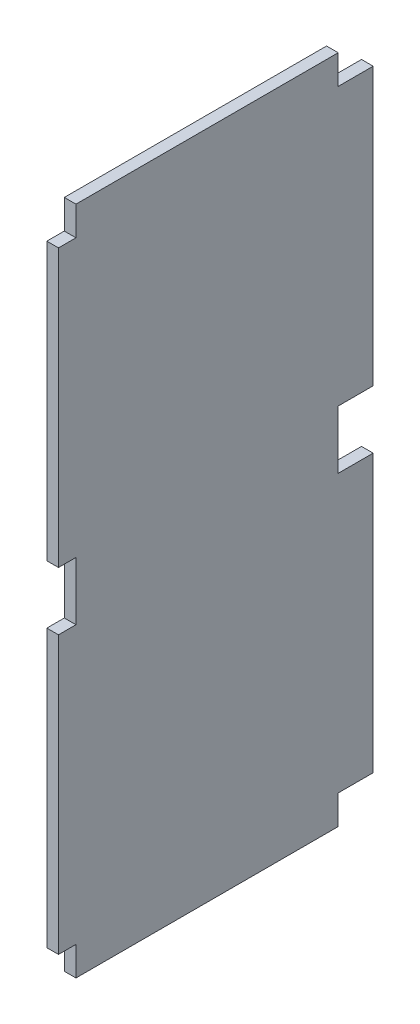
ISO-10303-21;
HEADER;
FILE_DESCRIPTION(('STEP AP214'),'2;1');
FILE_NAME('part.step','',(''),(''),'','','');
FILE_SCHEMA(('AUTOMOTIVE_DESIGN { 1 0 10303 214 1 1 1 1 }'));
ENDSEC;
DATA;
#1=APPLICATION_CONTEXT('core data for automotive mechanical design processes');
#2=APPLICATION_PROTOCOL_DEFINITION('international standard','automotive_design',2000,#1);
#3=PRODUCT_CONTEXT('',#1,'mechanical');
#4=PRODUCT('Part','Part','',(#3));
#5=PRODUCT_RELATED_PRODUCT_CATEGORY('part','',(#4));
#6=PRODUCT_DEFINITION_FORMATION('','',#4);
#7=PRODUCT_DEFINITION_CONTEXT('part definition',#1,'design');
#8=PRODUCT_DEFINITION('design','',#6,#7);
#9=PRODUCT_DEFINITION_SHAPE('','',#8);
#10=(LENGTH_UNIT() NAMED_UNIT(*) SI_UNIT(.MILLI.,.METRE.));
#11=(NAMED_UNIT(*) PLANE_ANGLE_UNIT() SI_UNIT($,.RADIAN.));
#12=(NAMED_UNIT(*) SI_UNIT($,.STERADIAN.) SOLID_ANGLE_UNIT());
#13=UNCERTAINTY_MEASURE_WITH_UNIT(LENGTH_MEASURE(1.E-05),#10,'distance_accuracy_value','');
#14=(GEOMETRIC_REPRESENTATION_CONTEXT(3) GLOBAL_UNCERTAINTY_ASSIGNED_CONTEXT((#13)) GLOBAL_UNIT_ASSIGNED_CONTEXT((#10,
#11,#12)) REPRESENTATION_CONTEXT('',''));
#15=CARTESIAN_POINT('',(0.,0.,0.));
#16=DIRECTION('',(0.,0.,1.));
#17=DIRECTION('',(1.,0.,0.));
#18=AXIS2_PLACEMENT_3D('',#15,#16,#17);
#19=CARTESIAN_POINT('',(5.99999999999998,52.5,153.019045891686));
#20=DIRECTION('',(0.,-1.,0.));
#21=DIRECTION('',(0.,0.,-1.));
#22=AXIS2_PLACEMENT_3D('',#19,#20,#21);
#23=PLANE('',#22);
#24=DIRECTION('',(0.,0.,-1.));
#25=VECTOR('',#24,1.);
#26=CARTESIAN_POINT('',(4.,52.5,153.019045891686));
#27=LINE('',#26,#25);
#28=CARTESIAN_POINT('',(4.00000000000001,52.5,0.));
#29=VERTEX_POINT('',#28);
#30=CARTESIAN_POINT('',(4.,52.5,-6.00000000000001));
#31=VERTEX_POINT('',#30);
#32=EDGE_CURVE('E206',#29,#31,#27,.T.);
#33=ORIENTED_EDGE('',*,*,#32,.F.);
#34=DIRECTION('',(1.,0.,0.));
#35=VECTOR('',#34,1.);
#36=CARTESIAN_POINT('',(4.00000000000001,52.5,0.));
#37=LINE('',#36,#35);
#38=CARTESIAN_POINT('',(5.99999999999999,52.5,0.));
#39=VERTEX_POINT('',#38);
#40=EDGE_CURVE('E190',#29,#39,#37,.T.);
#41=ORIENTED_EDGE('',*,*,#40,.T.);
#42=DIRECTION('',(0.,0.,-1.));
#43=VECTOR('',#42,1.);
#44=CARTESIAN_POINT('',(5.99999999999998,52.5,153.019045891686));
#45=LINE('',#44,#43);
#46=CARTESIAN_POINT('',(5.99999999999998,52.5,-6.00000000000001));
#47=VERTEX_POINT('',#46);
#48=EDGE_CURVE('E234',#39,#47,#45,.T.);
#49=ORIENTED_EDGE('',*,*,#48,.T.);
#50=DIRECTION('',(1.,0.,0.));
#51=VECTOR('',#50,1.);
#52=CARTESIAN_POINT('',(5.99999999999998,52.5,-6.00000000000001));
#53=LINE('',#52,#51);
#54=EDGE_CURVE('E230',#31,#47,#53,.T.);
#55=ORIENTED_EDGE('',*,*,#54,.F.);
#56=EDGE_LOOP('',(#33,#41,#49,#55));
#57=FACE_BOUND('',#56,.T.);
#58=ADVANCED_FACE('F33',(#57),#23,.F.);
#59=CARTESIAN_POINT('',(5.99999999999999,-52.5,153.019045891686));
#60=DIRECTION('',(0.,1.,0.));
#61=DIRECTION('',(0.,0.,1.));
#62=AXIS2_PLACEMENT_3D('',#59,#60,#61);
#63=PLANE('',#62);
#64=DIRECTION('',(-1.,0.,0.));
#65=VECTOR('',#64,1.);
#66=CARTESIAN_POINT('',(4.00000000000001,-52.5,45.));
#67=LINE('',#66,#65);
#68=CARTESIAN_POINT('',(5.99999999999999,-52.5,45.));
#69=VERTEX_POINT('',#68);
#70=CARTESIAN_POINT('',(4.00000000000001,-52.5,45.));
#71=VERTEX_POINT('',#70);
#72=EDGE_CURVE('E58',#69,#71,#67,.T.);
#73=ORIENTED_EDGE('',*,*,#72,.F.);
#74=DIRECTION('',(0.,0.,-1.));
#75=VECTOR('',#74,1.);
#76=CARTESIAN_POINT('',(5.99999999999999,-52.5,153.019045891686));
#77=LINE('',#76,#75);
#78=CARTESIAN_POINT('',(5.99999999999999,-52.5,48.));
#79=VERTEX_POINT('',#78);
#80=EDGE_CURVE('E239',#79,#69,#77,.T.);
#81=ORIENTED_EDGE('',*,*,#80,.F.);
#82=DIRECTION('',(1.,0.,0.));
#83=VECTOR('',#82,1.);
#84=CARTESIAN_POINT('',(5.99999999999999,-52.5,48.));
#85=LINE('',#84,#83);
#86=CARTESIAN_POINT('',(4.00000000000001,-52.5,48.));
#87=VERTEX_POINT('',#86);
#88=EDGE_CURVE('E247',#87,#79,#85,.T.);
#89=ORIENTED_EDGE('',*,*,#88,.F.);
#90=DIRECTION('',(0.,0.,-1.));
#91=VECTOR('',#90,1.);
#92=CARTESIAN_POINT('',(4.00000000000001,-52.5,153.019045891686));
#93=LINE('',#92,#91);
#94=EDGE_CURVE('E261',#87,#71,#93,.T.);
#95=ORIENTED_EDGE('',*,*,#94,.T.);
#96=EDGE_LOOP('',(#73,#81,#89,#95));
#97=FACE_BOUND('',#96,.T.);
#98=ADVANCED_FACE('F298',(#97),#63,.F.);
#99=DIRECTION('',(1.,0.,0.));
#100=VECTOR('',#99,1.);
#101=CARTESIAN_POINT('',(4.00000000000001,-52.5,0.));
#102=LINE('',#101,#100);
#103=CARTESIAN_POINT('',(4.00000000000001,-52.5,0.));
#104=VERTEX_POINT('',#103);
#105=CARTESIAN_POINT('',(5.99999999999999,-52.5,0.));
#106=VERTEX_POINT('',#105);
#107=EDGE_CURVE('E179',#104,#106,#102,.T.);
#108=ORIENTED_EDGE('',*,*,#107,.F.);
#109=CARTESIAN_POINT('',(4.00000000000001,-52.5,-6.00000000000001));
#110=VERTEX_POINT('',#109);
#111=EDGE_CURVE('E232',#104,#110,#93,.T.);
#112=ORIENTED_EDGE('',*,*,#111,.T.);
#113=DIRECTION('',(-1.,0.,0.));
#114=VECTOR('',#113,1.);
#115=CARTESIAN_POINT('',(5.99999999999999,-52.5,-6.00000000000001));
#116=LINE('',#115,#114);
#117=CARTESIAN_POINT('',(5.99999999999999,-52.5,-6.00000000000001));
#118=VERTEX_POINT('',#117);
#119=EDGE_CURVE('E335',#118,#110,#116,.T.);
#120=ORIENTED_EDGE('',*,*,#119,.F.);
#121=EDGE_CURVE('E302',#106,#118,#77,.T.);
#122=ORIENTED_EDGE('',*,*,#121,.F.);
#123=EDGE_LOOP('',(#108,#112,#120,#122));
#124=FACE_BOUND('',#123,.T.);
#125=ADVANCED_FACE('F349',(#124),#63,.F.);
#126=CARTESIAN_POINT('',(0.,0.,-6.));
#127=DIRECTION('',(0.,0.,1.));
#128=DIRECTION('',(0.,-1.,0.));
#129=AXIS2_PLACEMENT_3D('',#126,#127,#128);
#130=PLANE('',#129);
#131=DIRECTION('',(0.,1.,0.));
#132=VECTOR('',#131,1.);
#133=CARTESIAN_POINT('',(4.,52.5,-6.00000000000001));
#134=LINE('',#133,#132);
#135=CARTESIAN_POINT('',(4.,-5.,-6.00000000000001));
#136=VERTEX_POINT('',#135);
#137=EDGE_CURVE('E332',#110,#136,#134,.T.);
#138=ORIENTED_EDGE('',*,*,#137,.T.);
#139=DIRECTION('',(1.,0.,0.));
#140=VECTOR('',#139,1.);
#141=CARTESIAN_POINT('',(0.,-5.,-6.));
#142=LINE('',#141,#140);
#143=CARTESIAN_POINT('',(5.99999999999999,-5.,-6.00000000000001));
#144=VERTEX_POINT('',#143);
#145=EDGE_CURVE('E42',#136,#144,#142,.T.);
#146=ORIENTED_EDGE('',*,*,#145,.T.);
#147=DIRECTION('',(0.,-1.,0.));
#148=VECTOR('',#147,1.);
#149=CARTESIAN_POINT('',(5.99999999999998,52.5,-6.00000000000001));
#150=LINE('',#149,#148);
#151=EDGE_CURVE('E337',#144,#118,#150,.T.);
#152=ORIENTED_EDGE('',*,*,#151,.T.);
#153=ORIENTED_EDGE('',*,*,#119,.T.);
#154=EDGE_LOOP('',(#138,#146,#152,#153));
#155=FACE_BOUND('',#154,.T.);
#156=ADVANCED_FACE('F345',(#155),#130,.F.);
#157=CARTESIAN_POINT('',(0.,0.,48.));
#158=DIRECTION('',(0.,0.,1.));
#159=DIRECTION('',(0.,-1.,0.));
#160=AXIS2_PLACEMENT_3D('',#157,#158,#159);
#161=PLANE('',#160);
#162=DIRECTION('',(-1.,0.,0.));
#163=VECTOR('',#162,1.);
#164=CARTESIAN_POINT('',(0.,5.,48.));
#165=LINE('',#164,#163);
#166=CARTESIAN_POINT('',(5.99999999999998,5.,48.));
#167=VERTEX_POINT('',#166);
#168=CARTESIAN_POINT('',(4.,5.,48.));
#169=VERTEX_POINT('',#168);
#170=EDGE_CURVE('E271',#167,#169,#165,.T.);
#171=ORIENTED_EDGE('',*,*,#170,.F.);
#172=DIRECTION('',(0.,1.,0.));
#173=VECTOR('',#172,1.);
#174=CARTESIAN_POINT('',(5.99999999999998,52.5,48.));
#175=LINE('',#174,#173);
#176=CARTESIAN_POINT('',(5.99999999999998,52.5,48.));
#177=VERTEX_POINT('',#176);
#178=EDGE_CURVE('E290',#167,#177,#175,.T.);
#179=ORIENTED_EDGE('',*,*,#178,.T.);
#180=DIRECTION('',(-1.,0.,0.));
#181=VECTOR('',#180,1.);
#182=CARTESIAN_POINT('',(5.99999999999998,52.5,48.));
#183=LINE('',#182,#181);
#184=CARTESIAN_POINT('',(4.,52.5,48.));
#185=VERTEX_POINT('',#184);
#186=EDGE_CURVE('E284',#177,#185,#183,.T.);
#187=ORIENTED_EDGE('',*,*,#186,.T.);
#188=DIRECTION('',(0.,-1.,0.));
#189=VECTOR('',#188,1.);
#190=CARTESIAN_POINT('',(4.,52.5,48.));
#191=LINE('',#190,#189);
#192=EDGE_CURVE('E273',#185,#169,#191,.T.);
#193=ORIENTED_EDGE('',*,*,#192,.T.);
#194=EDGE_LOOP('',(#171,#179,#187,#193));
#195=FACE_BOUND('',#194,.T.);
#196=ADVANCED_FACE('F427',(#195),#161,.T.);
#197=CARTESIAN_POINT('',(5.99999999999998,52.5,153.019045891686));
#198=DIRECTION('',(-1.,0.,0.));
#199=DIRECTION('',(0.,-1.,0.));
#200=AXIS2_PLACEMENT_3D('',#197,#198,#199);
#201=PLANE('',#200);
#202=ORIENTED_EDGE('',*,*,#151,.F.);
#203=DIRECTION('',(0.,0.,-1.));
#204=VECTOR('',#203,1.);
#205=CARTESIAN_POINT('',(5.99999999999999,-5.,-6.00000000000001));
#206=LINE('',#205,#204);
#207=CARTESIAN_POINT('',(5.99999999999999,-5.,0.));
#208=VERTEX_POINT('',#207);
#209=EDGE_CURVE('E387',#208,#144,#206,.T.);
#210=ORIENTED_EDGE('',*,*,#209,.F.);
#211=DIRECTION('',(0.,-1.,0.));
#212=VECTOR('',#211,1.);
#213=CARTESIAN_POINT('',(5.99999999999999,0.,0.));
#214=LINE('',#213,#212);
#215=CARTESIAN_POINT('',(5.99999999999998,5.,0.));
#216=VERTEX_POINT('',#215);
#217=EDGE_CURVE('E366',#216,#208,#214,.T.);
#218=ORIENTED_EDGE('',*,*,#217,.F.);
#219=DIRECTION('',(0.,0.,1.));
#220=VECTOR('',#219,1.);
#221=CARTESIAN_POINT('',(5.99999999999998,5.,-6.00000000000001));
#222=LINE('',#221,#220);
#223=CARTESIAN_POINT('',(5.99999999999998,5.,-6.00000000000001));
#224=VERTEX_POINT('',#223);
#225=EDGE_CURVE('E362',#224,#216,#222,.T.);
#226=ORIENTED_EDGE('',*,*,#225,.F.);
#227=EDGE_CURVE('E338',#47,#224,#150,.T.);
#228=ORIENTED_EDGE('',*,*,#227,.F.);
#229=ORIENTED_EDGE('',*,*,#48,.F.);
#230=DIRECTION('',(0.,-1.,0.));
#231=VECTOR('',#230,1.);
#232=CARTESIAN_POINT('',(5.99999999999999,57.5,0.));
#233=LINE('',#232,#231);
#234=CARTESIAN_POINT('',(5.99999999999999,57.5,0.));
#235=VERTEX_POINT('',#234);
#236=EDGE_CURVE('E213',#235,#39,#233,.T.);
#237=ORIENTED_EDGE('',*,*,#236,.F.);
#238=DIRECTION('',(0.,0.,1.));
#239=VECTOR('',#238,1.);
#240=CARTESIAN_POINT('',(5.99999999999999,57.5,0.));
#241=LINE('',#240,#239);
#242=CARTESIAN_POINT('',(5.99999999999997,57.5,45.));
#243=VERTEX_POINT('',#242);
#244=EDGE_CURVE('E193',#235,#243,#241,.T.);
#245=ORIENTED_EDGE('',*,*,#244,.T.);
#246=DIRECTION('',(0.,-1.,0.));
#247=VECTOR('',#246,1.);
#248=CARTESIAN_POINT('',(5.99999999999997,57.5,45.));
#249=LINE('',#248,#247);
#250=CARTESIAN_POINT('',(5.99999999999997,52.5,45.));
#251=VERTEX_POINT('',#250);
#252=EDGE_CURVE('E180',#243,#251,#249,.T.);
#253=ORIENTED_EDGE('',*,*,#252,.T.);
#254=EDGE_CURVE('E231',#177,#251,#45,.T.);
#255=ORIENTED_EDGE('',*,*,#254,.F.);
#256=ORIENTED_EDGE('',*,*,#178,.F.);
#257=DIRECTION('',(0.,0.,1.));
#258=VECTOR('',#257,1.);
#259=CARTESIAN_POINT('',(5.99999999999998,5.,48.));
#260=LINE('',#259,#258);
#261=CARTESIAN_POINT('',(5.99999999999998,5.,45.));
#262=VERTEX_POINT('',#261);
#263=EDGE_CURVE('E313',#262,#167,#260,.T.);
#264=ORIENTED_EDGE('',*,*,#263,.F.);
#265=DIRECTION('',(0.,1.,0.));
#266=VECTOR('',#265,1.);
#267=CARTESIAN_POINT('',(5.99999999999998,5.,45.));
#268=LINE('',#267,#266);
#269=CARTESIAN_POINT('',(5.99999999999999,-5.,45.));
#270=VERTEX_POINT('',#269);
#271=EDGE_CURVE('E309',#270,#262,#268,.T.);
#272=ORIENTED_EDGE('',*,*,#271,.F.);
#273=DIRECTION('',(0.,0.,-1.));
#274=VECTOR('',#273,1.);
#275=CARTESIAN_POINT('',(5.99999999999999,-5.,48.));
#276=LINE('',#275,#274);
#277=CARTESIAN_POINT('',(5.99999999999999,-5.,48.));
#278=VERTEX_POINT('',#277);
#279=EDGE_CURVE('E306',#278,#270,#276,.T.);
#280=ORIENTED_EDGE('',*,*,#279,.F.);
#281=EDGE_CURVE('E288',#79,#278,#175,.T.);
#282=ORIENTED_EDGE('',*,*,#281,.F.);
#283=ORIENTED_EDGE('',*,*,#80,.T.);
#284=DIRECTION('',(0.,1.,0.));
#285=VECTOR('',#284,1.);
#286=CARTESIAN_POINT('',(5.99999999999997,-57.5,45.));
#287=LINE('',#286,#285);
#288=CARTESIAN_POINT('',(5.99999999999997,-57.5,45.));
#289=VERTEX_POINT('',#288);
#290=EDGE_CURVE('E368',#289,#69,#287,.T.);
#291=ORIENTED_EDGE('',*,*,#290,.F.);
#292=DIRECTION('',(0.,0.,1.));
#293=VECTOR('',#292,1.);
#294=CARTESIAN_POINT('',(5.99999999999999,-57.5,0.));
#295=LINE('',#294,#293);
#296=CARTESIAN_POINT('',(5.99999999999999,-57.5,0.));
#297=VERTEX_POINT('',#296);
#298=EDGE_CURVE('E459',#297,#289,#295,.T.);
#299=ORIENTED_EDGE('',*,*,#298,.F.);
#300=DIRECTION('',(0.,1.,0.));
#301=VECTOR('',#300,1.);
#302=CARTESIAN_POINT('',(5.99999999999999,-57.5,0.));
#303=LINE('',#302,#301);
#304=EDGE_CURVE('E363',#297,#106,#303,.T.);
#305=ORIENTED_EDGE('',*,*,#304,.T.);
#306=ORIENTED_EDGE('',*,*,#121,.T.);
#307=EDGE_LOOP('',(#202,#210,#218,#226,#228,#229,#237,#245,#253,#255,#256,#264,#272,#280,#282,
#283,#291,#299,#305,#306));
#308=FACE_BOUND('',#307,.T.);
#309=ADVANCED_FACE('F304',(#308),#201,.F.);
#310=ORIENTED_EDGE('',*,*,#254,.T.);
#311=DIRECTION('',(-1.,0.,0.));
#312=VECTOR('',#311,1.);
#313=CARTESIAN_POINT('',(4.00000000000001,52.5,45.));
#314=LINE('',#313,#312);
#315=CARTESIAN_POINT('',(4.,52.5,45.));
#316=VERTEX_POINT('',#315);
#317=EDGE_CURVE('E204',#251,#316,#314,.T.);
#318=ORIENTED_EDGE('',*,*,#317,.T.);
#319=EDGE_CURVE('E178',#185,#316,#27,.T.);
#320=ORIENTED_EDGE('',*,*,#319,.F.);
#321=ORIENTED_EDGE('',*,*,#186,.F.);
#322=EDGE_LOOP('',(#310,#318,#320,#321));
#323=FACE_BOUND('',#322,.T.);
#324=ADVANCED_FACE('F416',(#323),#23,.F.);
#325=CARTESIAN_POINT('',(4.,52.5,153.019045891686));
#326=DIRECTION('',(1.,0.,0.));
#327=DIRECTION('',(0.,1.,0.));
#328=AXIS2_PLACEMENT_3D('',#325,#326,#327);
#329=PLANE('',#328);
#330=DIRECTION('',(0.,-1.,0.));
#331=VECTOR('',#330,1.);
#332=CARTESIAN_POINT('',(4.,52.5,0.));
#333=LINE('',#332,#331);
#334=CARTESIAN_POINT('',(4.,5.,0.));
#335=VERTEX_POINT('',#334);
#336=CARTESIAN_POINT('',(4.,-5.,0.));
#337=VERTEX_POINT('',#336);
#338=EDGE_CURVE('E11',#335,#337,#333,.T.);
#339=ORIENTED_EDGE('',*,*,#338,.T.);
#340=DIRECTION('',(0.,0.,-1.));
#341=VECTOR('',#340,1.);
#342=CARTESIAN_POINT('',(4.,-5.00000000000009,153.019045891686));
#343=LINE('',#342,#341);
#344=EDGE_CURVE('E311',#337,#136,#343,.T.);
#345=ORIENTED_EDGE('',*,*,#344,.T.);
#346=ORIENTED_EDGE('',*,*,#137,.F.);
#347=ORIENTED_EDGE('',*,*,#111,.F.);
#348=DIRECTION('',(0.,1.,0.));
#349=VECTOR('',#348,1.);
#350=CARTESIAN_POINT('',(4.00000000000001,-57.5,0.));
#351=LINE('',#350,#349);
#352=CARTESIAN_POINT('',(4.00000000000001,-57.5,0.));
#353=VERTEX_POINT('',#352);
#354=EDGE_CURVE('E355',#353,#104,#351,.T.);
#355=ORIENTED_EDGE('',*,*,#354,.F.);
#356=DIRECTION('',(0.,0.,-1.));
#357=VECTOR('',#356,1.);
#358=CARTESIAN_POINT('',(4.00000000000001,-57.5,0.));
#359=LINE('',#358,#357);
#360=CARTESIAN_POINT('',(4.00000000000001,-57.5,45.));
#361=VERTEX_POINT('',#360);
#362=EDGE_CURVE('E377',#361,#353,#359,.T.);
#363=ORIENTED_EDGE('',*,*,#362,.F.);
#364=DIRECTION('',(0.,1.,0.));
#365=VECTOR('',#364,1.);
#366=CARTESIAN_POINT('',(4.00000000000001,-57.5,45.));
#367=LINE('',#366,#365);
#368=EDGE_CURVE('E378',#361,#71,#367,.T.);
#369=ORIENTED_EDGE('',*,*,#368,.T.);
#370=ORIENTED_EDGE('',*,*,#94,.F.);
#371=CARTESIAN_POINT('',(4.,-5.,48.));
#372=VERTEX_POINT('',#371);
#373=EDGE_CURVE('E279',#372,#87,#191,.T.);
#374=ORIENTED_EDGE('',*,*,#373,.F.);
#375=DIRECTION('',(0.,0.,-1.));
#376=VECTOR('',#375,1.);
#377=CARTESIAN_POINT('',(4.,-4.99999999999984,153.019045891686));
#378=LINE('',#377,#376);
#379=CARTESIAN_POINT('',(4.,-5.,45.));
#380=VERTEX_POINT('',#379);
#381=EDGE_CURVE('E324',#372,#380,#378,.T.);
#382=ORIENTED_EDGE('',*,*,#381,.T.);
#383=DIRECTION('',(0.,1.,0.));
#384=VECTOR('',#383,1.);
#385=CARTESIAN_POINT('',(4.,52.5,45.));
#386=LINE('',#385,#384);
#387=CARTESIAN_POINT('',(4.,5.,45.));
#388=VERTEX_POINT('',#387);
#389=EDGE_CURVE('E268',#380,#388,#386,.T.);
#390=ORIENTED_EDGE('',*,*,#389,.T.);
#391=DIRECTION('',(0.,0.,1.));
#392=VECTOR('',#391,1.);
#393=CARTESIAN_POINT('',(4.,5.00000000000016,153.019045891686));
#394=LINE('',#393,#392);
#395=EDGE_CURVE('E328',#388,#169,#394,.T.);
#396=ORIENTED_EDGE('',*,*,#395,.T.);
#397=ORIENTED_EDGE('',*,*,#192,.F.);
#398=ORIENTED_EDGE('',*,*,#319,.T.);
#399=DIRECTION('',(0.,-1.,0.));
#400=VECTOR('',#399,1.);
#401=CARTESIAN_POINT('',(4.00000000000001,57.5,45.));
#402=LINE('',#401,#400);
#403=CARTESIAN_POINT('',(4.00000000000001,57.5,45.));
#404=VERTEX_POINT('',#403);
#405=EDGE_CURVE('E50',#404,#316,#402,.T.);
#406=ORIENTED_EDGE('',*,*,#405,.F.);
#407=DIRECTION('',(0.,0.,-1.));
#408=VECTOR('',#407,1.);
#409=CARTESIAN_POINT('',(4.00000000000001,57.5,0.));
#410=LINE('',#409,#408);
#411=CARTESIAN_POINT('',(4.00000000000001,57.5,0.));
#412=VERTEX_POINT('',#411);
#413=EDGE_CURVE('E175',#404,#412,#410,.T.);
#414=ORIENTED_EDGE('',*,*,#413,.T.);
#415=DIRECTION('',(0.,-1.,0.));
#416=VECTOR('',#415,1.);
#417=CARTESIAN_POINT('',(4.00000000000001,57.5,0.));
#418=LINE('',#417,#416);
#419=EDGE_CURVE('E198',#412,#29,#418,.T.);
#420=ORIENTED_EDGE('',*,*,#419,.T.);
#421=ORIENTED_EDGE('',*,*,#32,.T.);
#422=CARTESIAN_POINT('',(4.,5.,-6.00000000000001));
#423=VERTEX_POINT('',#422);
#424=EDGE_CURVE('E331',#423,#31,#134,.T.);
#425=ORIENTED_EDGE('',*,*,#424,.F.);
#426=DIRECTION('',(0.,0.,1.));
#427=VECTOR('',#426,1.);
#428=CARTESIAN_POINT('',(4.,4.99999999999998,153.019045891686));
#429=LINE('',#428,#427);
#430=EDGE_CURVE('E316',#423,#335,#429,.T.);
#431=ORIENTED_EDGE('',*,*,#430,.T.);
#432=EDGE_LOOP('',(#339,#345,#346,#347,#355,#363,#369,#370,#374,#382,#390,#396,#397,#398,#406,
#414,#420,#421,#425,#431));
#433=FACE_BOUND('',#432,.T.);
#434=ADVANCED_FACE('F174',(#433),#329,.F.);
#435=DIRECTION('',(1.,0.,0.));
#436=VECTOR('',#435,1.);
#437=CARTESIAN_POINT('',(0.,-5.,48.));
#438=LINE('',#437,#436);
#439=EDGE_CURVE('E272',#372,#278,#438,.T.);
#440=ORIENTED_EDGE('',*,*,#439,.F.);
#441=ORIENTED_EDGE('',*,*,#373,.T.);
#442=ORIENTED_EDGE('',*,*,#88,.T.);
#443=ORIENTED_EDGE('',*,*,#281,.T.);
#444=EDGE_LOOP('',(#440,#441,#442,#443));
#445=FACE_BOUND('',#444,.T.);
#446=ADVANCED_FACE('F35',(#445),#161,.T.);
#447=ORIENTED_EDGE('',*,*,#227,.T.);
#448=DIRECTION('',(-1.,0.,0.));
#449=VECTOR('',#448,1.);
#450=CARTESIAN_POINT('',(0.,5.,-6.));
#451=LINE('',#450,#449);
#452=EDGE_CURVE('E265',#224,#423,#451,.T.);
#453=ORIENTED_EDGE('',*,*,#452,.T.);
#454=ORIENTED_EDGE('',*,*,#424,.T.);
#455=ORIENTED_EDGE('',*,*,#54,.T.);
#456=EDGE_LOOP('',(#447,#453,#454,#455));
#457=FACE_BOUND('',#456,.T.);
#458=ADVANCED_FACE('F397',(#457),#130,.F.);
#459=CARTESIAN_POINT('',(-4.00000000000002,5.,45.));
#460=DIRECTION('',(0.,0.,-1.));
#461=DIRECTION('',(-1.,0.,0.));
#462=AXIS2_PLACEMENT_3D('',#459,#460,#461);
#463=PLANE('',#462);
#464=DIRECTION('',(1.,0.,0.));
#465=VECTOR('',#464,1.);
#466=CARTESIAN_POINT('',(-4.00000000000001,-5.,45.));
#467=LINE('',#466,#465);
#468=EDGE_CURVE('E321',#380,#270,#467,.T.);
#469=ORIENTED_EDGE('',*,*,#468,.T.);
#470=ORIENTED_EDGE('',*,*,#271,.T.);
#471=DIRECTION('',(1.,0.,0.));
#472=VECTOR('',#471,1.);
#473=CARTESIAN_POINT('',(-4.00000000000002,5.,45.));
#474=LINE('',#473,#472);
#475=EDGE_CURVE('E322',#388,#262,#474,.T.);
#476=ORIENTED_EDGE('',*,*,#475,.F.);
#477=ORIENTED_EDGE('',*,*,#389,.F.);
#478=EDGE_LOOP('',(#469,#470,#476,#477));
#479=FACE_BOUND('',#478,.T.);
#480=ADVANCED_FACE('F439',(#479),#463,.F.);
#481=CARTESIAN_POINT('',(-4.00000000000002,5.,48.));
#482=DIRECTION('',(0.,1.,0.));
#483=DIRECTION('',(0.,0.,1.));
#484=AXIS2_PLACEMENT_3D('',#481,#482,#483);
#485=PLANE('',#484);
#486=ORIENTED_EDGE('',*,*,#475,.T.);
#487=ORIENTED_EDGE('',*,*,#263,.T.);
#488=ORIENTED_EDGE('',*,*,#170,.T.);
#489=ORIENTED_EDGE('',*,*,#395,.F.);
#490=EDGE_LOOP('',(#486,#487,#488,#489));
#491=FACE_BOUND('',#490,.T.);
#492=ADVANCED_FACE('F443',(#491),#485,.F.);
#493=CARTESIAN_POINT('',(-4.00000000000001,-5.,48.));
#494=DIRECTION('',(0.,-1.,0.));
#495=DIRECTION('',(0.,0.,-1.));
#496=AXIS2_PLACEMENT_3D('',#493,#494,#495);
#497=PLANE('',#496);
#498=ORIENTED_EDGE('',*,*,#439,.T.);
#499=ORIENTED_EDGE('',*,*,#279,.T.);
#500=ORIENTED_EDGE('',*,*,#468,.F.);
#501=ORIENTED_EDGE('',*,*,#381,.F.);
#502=EDGE_LOOP('',(#498,#499,#500,#501));
#503=FACE_BOUND('',#502,.T.);
#504=ADVANCED_FACE('F411',(#503),#497,.F.);
#505=CARTESIAN_POINT('',(-4.00000000000002,0.,0.));
#506=DIRECTION('',(0.,0.,1.));
#507=DIRECTION('',(1.,0.,0.));
#508=AXIS2_PLACEMENT_3D('',#505,#506,#507);
#509=PLANE('',#508);
#510=DIRECTION('',(1.,0.,0.));
#511=VECTOR('',#510,1.);
#512=CARTESIAN_POINT('',(-4.00000000000002,5.,0.));
#513=LINE('',#512,#511);
#514=EDGE_CURVE('E389',#335,#216,#513,.T.);
#515=ORIENTED_EDGE('',*,*,#514,.T.);
#516=ORIENTED_EDGE('',*,*,#217,.T.);
#517=DIRECTION('',(1.,0.,0.));
#518=VECTOR('',#517,1.);
#519=CARTESIAN_POINT('',(-4.00000000000001,-5.,0.));
#520=LINE('',#519,#518);
#521=EDGE_CURVE('E390',#337,#208,#520,.T.);
#522=ORIENTED_EDGE('',*,*,#521,.F.);
#523=ORIENTED_EDGE('',*,*,#338,.F.);
#524=EDGE_LOOP('',(#515,#516,#522,#523));
#525=FACE_BOUND('',#524,.T.);
#526=ADVANCED_FACE('F401',(#525),#509,.F.);
#527=CARTESIAN_POINT('',(-4.00000000000001,-5.,-6.00000000000001));
#528=DIRECTION('',(0.,-1.,0.));
#529=DIRECTION('',(0.,0.,-1.));
#530=AXIS2_PLACEMENT_3D('',#527,#528,#529);
#531=PLANE('',#530);
#532=ORIENTED_EDGE('',*,*,#521,.T.);
#533=ORIENTED_EDGE('',*,*,#209,.T.);
#534=ORIENTED_EDGE('',*,*,#145,.F.);
#535=ORIENTED_EDGE('',*,*,#344,.F.);
#536=EDGE_LOOP('',(#532,#533,#534,#535));
#537=FACE_BOUND('',#536,.T.);
#538=ADVANCED_FACE('F403',(#537),#531,.F.);
#539=CARTESIAN_POINT('',(-4.00000000000002,5.,-6.00000000000001));
#540=DIRECTION('',(0.,1.,0.));
#541=DIRECTION('',(0.,0.,1.));
#542=AXIS2_PLACEMENT_3D('',#539,#540,#541);
#543=PLANE('',#542);
#544=ORIENTED_EDGE('',*,*,#452,.F.);
#545=ORIENTED_EDGE('',*,*,#225,.T.);
#546=ORIENTED_EDGE('',*,*,#514,.F.);
#547=ORIENTED_EDGE('',*,*,#430,.F.);
#548=EDGE_LOOP('',(#544,#545,#546,#547));
#549=FACE_BOUND('',#548,.T.);
#550=ADVANCED_FACE('F395',(#549),#543,.F.);
#551=CARTESIAN_POINT('',(4.00000000000001,-57.5,0.));
#552=DIRECTION('',(0.,0.,1.));
#553=DIRECTION('',(1.,0.,0.));
#554=AXIS2_PLACEMENT_3D('',#551,#552,#553);
#555=PLANE('',#554);
#556=ORIENTED_EDGE('',*,*,#107,.T.);
#557=ORIENTED_EDGE('',*,*,#304,.F.);
#558=DIRECTION('',(1.,0.,0.));
#559=VECTOR('',#558,1.);
#560=CARTESIAN_POINT('',(4.00000000000001,-57.5,0.));
#561=LINE('',#560,#559);
#562=EDGE_CURVE('E360',#353,#297,#561,.T.);
#563=ORIENTED_EDGE('',*,*,#562,.F.);
#564=ORIENTED_EDGE('',*,*,#354,.T.);
#565=EDGE_LOOP('',(#556,#557,#563,#564));
#566=FACE_BOUND('',#565,.T.);
#567=ADVANCED_FACE('F357',(#566),#555,.F.);
#568=CARTESIAN_POINT('',(4.00000000000001,-57.5,45.));
#569=DIRECTION('',(0.,0.,-1.));
#570=DIRECTION('',(-1.,0.,0.));
#571=AXIS2_PLACEMENT_3D('',#568,#569,#570);
#572=PLANE('',#571);
#573=ORIENTED_EDGE('',*,*,#72,.T.);
#574=ORIENTED_EDGE('',*,*,#368,.F.);
#575=DIRECTION('',(-1.,0.,0.));
#576=VECTOR('',#575,1.);
#577=CARTESIAN_POINT('',(4.00000000000001,-57.5,45.));
#578=LINE('',#577,#576);
#579=EDGE_CURVE('E458',#289,#361,#578,.T.);
#580=ORIENTED_EDGE('',*,*,#579,.F.);
#581=ORIENTED_EDGE('',*,*,#290,.T.);
#582=EDGE_LOOP('',(#573,#574,#580,#581));
#583=FACE_BOUND('',#582,.T.);
#584=ADVANCED_FACE('F465',(#583),#572,.F.);
#585=CARTESIAN_POINT('',(0.,-57.5,0.));
#586=DIRECTION('',(0.,1.,0.));
#587=DIRECTION('',(0.,0.,1.));
#588=AXIS2_PLACEMENT_3D('',#585,#586,#587);
#589=PLANE('',#588);
#590=ORIENTED_EDGE('',*,*,#362,.T.);
#591=ORIENTED_EDGE('',*,*,#562,.T.);
#592=ORIENTED_EDGE('',*,*,#298,.T.);
#593=ORIENTED_EDGE('',*,*,#579,.T.);
#594=EDGE_LOOP('',(#590,#591,#592,#593));
#595=FACE_BOUND('',#594,.T.);
#596=ADVANCED_FACE('F463',(#595),#589,.F.);
#597=CARTESIAN_POINT('',(4.00000000000001,57.5,45.));
#598=DIRECTION('',(0.,0.,1.));
#599=DIRECTION('',(1.,0.,0.));
#600=AXIS2_PLACEMENT_3D('',#597,#598,#599);
#601=PLANE('',#600);
#602=ORIENTED_EDGE('',*,*,#317,.F.);
#603=ORIENTED_EDGE('',*,*,#252,.F.);
#604=DIRECTION('',(-1.,0.,0.));
#605=VECTOR('',#604,1.);
#606=CARTESIAN_POINT('',(4.00000000000001,57.5,45.));
#607=LINE('',#606,#605);
#608=EDGE_CURVE('E186',#243,#404,#607,.T.);
#609=ORIENTED_EDGE('',*,*,#608,.T.);
#610=ORIENTED_EDGE('',*,*,#405,.T.);
#611=EDGE_LOOP('',(#602,#603,#609,#610));
#612=FACE_BOUND('',#611,.T.);
#613=ADVANCED_FACE('F192',(#612),#601,.T.);
#614=CARTESIAN_POINT('',(4.00000000000001,57.5,0.));
#615=DIRECTION('',(0.,0.,-1.));
#616=DIRECTION('',(-1.,0.,0.));
#617=AXIS2_PLACEMENT_3D('',#614,#615,#616);
#618=PLANE('',#617);
#619=ORIENTED_EDGE('',*,*,#40,.F.);
#620=ORIENTED_EDGE('',*,*,#419,.F.);
#621=DIRECTION('',(1.,0.,0.));
#622=VECTOR('',#621,1.);
#623=CARTESIAN_POINT('',(4.00000000000001,57.5,0.));
#624=LINE('',#623,#622);
#625=EDGE_CURVE('E189',#412,#235,#624,.T.);
#626=ORIENTED_EDGE('',*,*,#625,.T.);
#627=ORIENTED_EDGE('',*,*,#236,.T.);
#628=EDGE_LOOP('',(#619,#620,#626,#627));
#629=FACE_BOUND('',#628,.T.);
#630=ADVANCED_FACE('F225',(#629),#618,.T.);
#631=CARTESIAN_POINT('',(0.,57.5,0.));
#632=DIRECTION('',(0.,-1.,0.));
#633=DIRECTION('',(0.,0.,1.));
#634=AXIS2_PLACEMENT_3D('',#631,#632,#633);
#635=PLANE('',#634);
#636=ORIENTED_EDGE('',*,*,#413,.F.);
#637=ORIENTED_EDGE('',*,*,#608,.F.);
#638=ORIENTED_EDGE('',*,*,#244,.F.);
#639=ORIENTED_EDGE('',*,*,#625,.F.);
#640=EDGE_LOOP('',(#636,#637,#638,#639));
#641=FACE_BOUND('',#640,.T.);
#642=ADVANCED_FACE('F184',(#641),#635,.F.);
#643=CLOSED_SHELL('',(#58,#98,#125,#156,#196,#309,#324,#434,#446,#458,#480,#492,#504,#526,#538,
#550,#567,#584,#596,#613,#630,#642));
#644=MANIFOLD_SOLID_BREP('B2',#643);
#645=ADVANCED_BREP_SHAPE_REPRESENTATION('',(#18,#644),#14);
#646=SHAPE_DEFINITION_REPRESENTATION(#9,#645);
ENDSEC;
END-ISO-10303-21;
